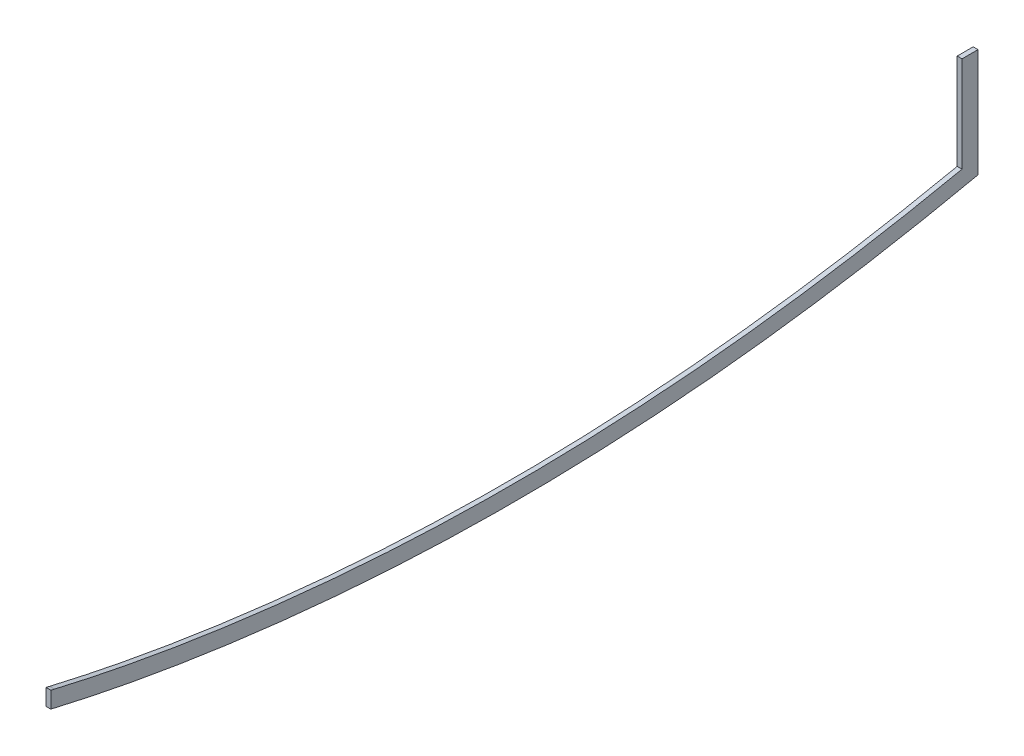
ISO-10303-21;
HEADER;
FILE_DESCRIPTION(('STEP AP214'),'2;1');
FILE_NAME('part.step','',(''),(''),'','','');
FILE_SCHEMA(('AUTOMOTIVE_DESIGN { 1 0 10303 214 1 1 1 1 }'));
ENDSEC;
DATA;
#1=APPLICATION_CONTEXT('core data for automotive mechanical design processes');
#2=APPLICATION_PROTOCOL_DEFINITION('international standard','automotive_design',2000,#1);
#3=PRODUCT_CONTEXT('',#1,'mechanical');
#4=PRODUCT('Part','Part','',(#3));
#5=PRODUCT_RELATED_PRODUCT_CATEGORY('part','',(#4));
#6=PRODUCT_DEFINITION_FORMATION('','',#4);
#7=PRODUCT_DEFINITION_CONTEXT('part definition',#1,'design');
#8=PRODUCT_DEFINITION('design','',#6,#7);
#9=PRODUCT_DEFINITION_SHAPE('','',#8);
#10=(LENGTH_UNIT() NAMED_UNIT(*) SI_UNIT(.MILLI.,.METRE.));
#11=(NAMED_UNIT(*) PLANE_ANGLE_UNIT() SI_UNIT($,.RADIAN.));
#12=(NAMED_UNIT(*) SI_UNIT($,.STERADIAN.) SOLID_ANGLE_UNIT());
#13=UNCERTAINTY_MEASURE_WITH_UNIT(LENGTH_MEASURE(1.E-05),#10,'distance_accuracy_value','');
#14=(GEOMETRIC_REPRESENTATION_CONTEXT(3) GLOBAL_UNCERTAINTY_ASSIGNED_CONTEXT((#13)) GLOBAL_UNIT_ASSIGNED_CONTEXT((#10,
#11,#12)) REPRESENTATION_CONTEXT('',''));
#15=CARTESIAN_POINT('',(0.,0.,0.));
#16=DIRECTION('',(0.,0.,1.));
#17=DIRECTION('',(1.,0.,0.));
#18=AXIS2_PLACEMENT_3D('',#15,#16,#17);
#19=CARTESIAN_POINT('',(1.51,100.,0.));
#20=DIRECTION('',(0.,0.,-1.));
#21=DIRECTION('',(0.,1.,0.));
#22=AXIS2_PLACEMENT_3D('',#19,#20,#21);
#23=PLANE('',#22);
#24=DIRECTION('',(0.,-1.,0.));
#25=VECTOR('',#24,1.);
#26=CARTESIAN_POINT('',(-1.51,100.,0.));
#27=LINE('',#26,#25);
#28=CARTESIAN_POINT('',(-1.51,100.,0.));
#29=VERTEX_POINT('',#28);
#30=CARTESIAN_POINT('',(-1.51,32.1459010137506,0.));
#31=VERTEX_POINT('',#30);
#32=EDGE_CURVE('E218',#29,#31,#27,.T.);
#33=ORIENTED_EDGE('',*,*,#32,.F.);
#34=DIRECTION('',(-1.,0.,0.));
#35=VECTOR('',#34,1.);
#36=CARTESIAN_POINT('',(1.51,100.,0.));
#37=LINE('',#36,#35);
#38=CARTESIAN_POINT('',(1.51,100.,0.));
#39=VERTEX_POINT('',#38);
#40=EDGE_CURVE('E11',#39,#29,#37,.T.);
#41=ORIENTED_EDGE('',*,*,#40,.F.);
#42=DIRECTION('',(0.,-1.,0.));
#43=VECTOR('',#42,1.);
#44=CARTESIAN_POINT('',(1.51,42.3778465393816,0.));
#45=LINE('',#44,#43);
#46=CARTESIAN_POINT('',(1.51,32.1459010137506,0.));
#47=VERTEX_POINT('',#46);
#48=EDGE_CURVE('E55',#39,#47,#45,.T.);
#49=ORIENTED_EDGE('',*,*,#48,.T.);
#50=DIRECTION('',(-1.,0.,0.));
#51=VECTOR('',#50,1.);
#52=CARTESIAN_POINT('',(1.51,32.1459010137506,0.));
#53=LINE('',#52,#51);
#54=EDGE_CURVE('E40',#47,#31,#53,.T.);
#55=ORIENTED_EDGE('',*,*,#54,.T.);
#56=EDGE_LOOP('',(#33,#41,#49,#55));
#57=FACE_BOUND('',#56,.T.);
#58=ADVANCED_FACE('F35',(#57),#23,.T.);
#59=CARTESIAN_POINT('',(1.51,100.,0.));
#60=DIRECTION('',(0.,-1.,0.));
#61=DIRECTION('',(0.,0.,-1.));
#62=AXIS2_PLACEMENT_3D('',#59,#60,#61);
#63=PLANE('',#62);
#64=DIRECTION('',(0.,0.,1.));
#65=VECTOR('',#64,1.);
#66=CARTESIAN_POINT('',(-1.51,100.,0.));
#67=LINE('',#66,#65);
#68=CARTESIAN_POINT('',(-1.51,100.,10.));
#69=VERTEX_POINT('',#68);
#70=EDGE_CURVE('E80',#29,#69,#67,.T.);
#71=ORIENTED_EDGE('',*,*,#70,.T.);
#72=DIRECTION('',(-1.,0.,0.));
#73=VECTOR('',#72,1.);
#74=CARTESIAN_POINT('',(1.51,100.,10.));
#75=LINE('',#74,#73);
#76=CARTESIAN_POINT('',(1.51,100.,10.));
#77=VERTEX_POINT('',#76);
#78=EDGE_CURVE('E46',#77,#69,#75,.T.);
#79=ORIENTED_EDGE('',*,*,#78,.F.);
#80=DIRECTION('',(0.,0.,1.));
#81=VECTOR('',#80,1.);
#82=CARTESIAN_POINT('',(1.51,100.,0.));
#83=LINE('',#82,#81);
#84=EDGE_CURVE('E107',#39,#77,#83,.T.);
#85=ORIENTED_EDGE('',*,*,#84,.F.);
#86=ORIENTED_EDGE('',*,*,#40,.T.);
#87=EDGE_LOOP('',(#71,#79,#85,#86));
#88=FACE_BOUND('',#87,.T.);
#89=ADVANCED_FACE('F150',(#88),#63,.F.);
#90=CARTESIAN_POINT('',(1.51,100.,10.));
#91=DIRECTION('',(0.,0.,-1.));
#92=DIRECTION('',(0.,1.,0.));
#93=AXIS2_PLACEMENT_3D('',#90,#91,#92);
#94=PLANE('',#93);
#95=DIRECTION('',(0.,-1.,0.));
#96=VECTOR('',#95,1.);
#97=CARTESIAN_POINT('',(-1.51,100.,10.));
#98=LINE('',#97,#96);
#99=CARTESIAN_POINT('',(-1.51,40.232191822545,10.));
#100=VERTEX_POINT('',#99);
#101=EDGE_CURVE('E114',#69,#100,#98,.T.);
#102=ORIENTED_EDGE('',*,*,#101,.T.);
#103=DIRECTION('',(-1.,0.,0.));
#104=VECTOR('',#103,1.);
#105=CARTESIAN_POINT('',(1.51,40.232191822545,10.));
#106=LINE('',#105,#104);
#107=CARTESIAN_POINT('',(1.51,40.232191822545,10.));
#108=VERTEX_POINT('',#107);
#109=EDGE_CURVE('E111',#108,#100,#106,.T.);
#110=ORIENTED_EDGE('',*,*,#109,.F.);
#111=DIRECTION('',(0.,-1.,0.));
#112=VECTOR('',#111,1.);
#113=CARTESIAN_POINT('',(1.51,100.,10.));
#114=LINE('',#113,#112);
#115=EDGE_CURVE('E101',#77,#108,#114,.T.);
#116=ORIENTED_EDGE('',*,*,#115,.F.);
#117=ORIENTED_EDGE('',*,*,#78,.T.);
#118=EDGE_LOOP('',(#102,#110,#116,#117));
#119=FACE_BOUND('',#118,.T.);
#120=ADVANCED_FACE('F112',(#119),#94,.F.);
#121=CARTESIAN_POINT('',(1.51,41.9191898754312,2.11715457977326));
#122=CARTESIAN_POINT('',(1.51,36.7950394779556,25.771456232945));
#123=CARTESIAN_POINT('',(1.51,27.6035902050565,73.3309980357778));
#124=CARTESIAN_POINT('',(1.51,17.4373162397921,145.201303122153));
#125=CARTESIAN_POINT('',(1.51,11.3529649659935,217.502733896193));
#126=CARTESIAN_POINT('',(1.51,9.32350363042354,290.057426723332));
#127=CARTESIAN_POINT('',(1.51,11.3622259507088,362.585666446086));
#128=CARTESIAN_POINT('',(1.51,17.513405403078,434.900779803499));
#129=CARTESIAN_POINT('',(1.51,27.459673586485,506.835309128288));
#130=CARTESIAN_POINT('',(1.51,36.8957426984709,554.205734679975));
#131=CARTESIAN_POINT('',(1.51,42.4202172828877,577.712135072867));
#132=B_SPLINE_CURVE_WITH_KNOTS('',3,(#121,#122,#123,#124,#125,#126,#127,#128,#129,#130,#131),
.UNSPECIFIED.,.F.,.F.,(4,1,1,1,1,1,1,1,4),(0.,0.125,0.25,0.375,0.5,0.625,0.75,0.875,1.),.UNSPECIFIED.);
#133=DIRECTION('',(-1.,0.,0.));
#134=VECTOR('',#133,1.);
#135=SURFACE_OF_LINEAR_EXTRUSION('',#132,#134);
#136=CARTESIAN_POINT('',(-1.51,41.9191898754312,2.11715457977326));
#137=CARTESIAN_POINT('',(-1.51,36.7950394779556,25.771456232945));
#138=CARTESIAN_POINT('',(-1.51,27.6035902050565,73.3309980357778));
#139=CARTESIAN_POINT('',(-1.51,17.4373162397921,145.201303122153));
#140=CARTESIAN_POINT('',(-1.51,11.3529649659935,217.502733896193));
#141=CARTESIAN_POINT('',(-1.51,9.32350363042354,290.057426723332));
#142=CARTESIAN_POINT('',(-1.51,11.3622259507088,362.585666446086));
#143=CARTESIAN_POINT('',(-1.51,17.513405403078,434.900779803499));
#144=CARTESIAN_POINT('',(-1.51,27.459673586485,506.835309128288));
#145=CARTESIAN_POINT('',(-1.51,36.8957426984709,554.205734679975));
#146=CARTESIAN_POINT('',(-1.51,42.4202172828877,577.712135072867));
#147=B_SPLINE_CURVE_WITH_KNOTS('',3,(#136,#137,#138,#139,#140,#141,#142,#143,#144,#145,#146),
.UNSPECIFIED.,.F.,.F.,(4,1,1,1,1,1,1,1,4),(0.,0.125,0.25,0.375,0.5,0.625,0.75,0.875,1.),.UNSPECIFIED.);
#148=CARTESIAN_POINT('',(-1.51,42.4202172828877,577.712135072867));
#149=VERTEX_POINT('',#148);
#150=EDGE_CURVE('E235',#100,#149,#147,.T.);
#151=ORIENTED_EDGE('',*,*,#150,.T.);
#152=DIRECTION('',(-1.,0.,0.));
#153=VECTOR('',#152,1.);
#154=CARTESIAN_POINT('',(1.51,42.4202172828877,577.712135072867));
#155=LINE('',#154,#153);
#156=CARTESIAN_POINT('',(1.51,42.4202172828877,577.712135072867));
#157=VERTEX_POINT('',#156);
#158=EDGE_CURVE('E117',#157,#149,#155,.T.);
#159=ORIENTED_EDGE('',*,*,#158,.F.);
#160=EDGE_CURVE('E105',#108,#157,#132,.T.);
#161=ORIENTED_EDGE('',*,*,#160,.F.);
#162=ORIENTED_EDGE('',*,*,#109,.T.);
#163=EDGE_LOOP('',(#151,#159,#161,#162));
#164=FACE_BOUND('',#163,.T.);
#165=ADVANCED_FACE('F119',(#164),#135,.F.);
#166=CARTESIAN_POINT('',(1.51,42.4202172828877,577.712135072867));
#167=DIRECTION('',(0.,-0.973476635271955,0.228786451914427));
#168=DIRECTION('',(0.,-0.228786451914427,-0.973476635271955));
#169=AXIS2_PLACEMENT_3D('',#166,#167,#168);
#170=PLANE('',#169);
#171=DIRECTION('',(0.,0.228786451914427,0.973476635271955));
#172=VECTOR('',#171,1.);
#173=CARTESIAN_POINT('',(-1.51,42.4202172828877,577.712135072867));
#174=LINE('',#173,#172);
#175=CARTESIAN_POINT('',(-1.51,42.9579111389372,579.999999592));
#176=VERTEX_POINT('',#175);
#177=EDGE_CURVE('E226',#149,#176,#174,.T.);
#178=ORIENTED_EDGE('',*,*,#177,.T.);
#179=DIRECTION('',(-1.,0.,0.));
#180=VECTOR('',#179,1.);
#181=CARTESIAN_POINT('',(1.51,42.9579111389372,579.999999592));
#182=LINE('',#181,#180);
#183=CARTESIAN_POINT('',(1.51,42.9579111389372,579.999999592));
#184=VERTEX_POINT('',#183);
#185=EDGE_CURVE('E246',#184,#176,#182,.T.);
#186=ORIENTED_EDGE('',*,*,#185,.F.);
#187=DIRECTION('',(0.,0.228786451914427,0.973476635271955));
#188=VECTOR('',#187,1.);
#189=CARTESIAN_POINT('',(1.51,42.4202172828877,577.712135072867));
#190=LINE('',#189,#188);
#191=EDGE_CURVE('E122',#157,#184,#190,.T.);
#192=ORIENTED_EDGE('',*,*,#191,.F.);
#193=ORIENTED_EDGE('',*,*,#158,.T.);
#194=EDGE_LOOP('',(#178,#186,#192,#193));
#195=FACE_BOUND('',#194,.T.);
#196=ADVANCED_FACE('F138',(#195),#170,.F.);
#197=CARTESIAN_POINT('',(1.51,42.9579111389372,579.999999592));
#198=DIRECTION('',(0.,0.,-1.));
#199=DIRECTION('',(-1.,0.,0.));
#200=AXIS2_PLACEMENT_3D('',#197,#198,#199);
#201=PLANE('',#200);
#202=DIRECTION('',(0.,-1.,0.));
#203=VECTOR('',#202,1.);
#204=CARTESIAN_POINT('',(-1.51,42.9579111389372,579.999999592));
#205=LINE('',#204,#203);
#206=CARTESIAN_POINT('',(-1.51,32.6854509301656,579.999999592));
#207=VERTEX_POINT('',#206);
#208=EDGE_CURVE('E224',#176,#207,#205,.T.);
#209=ORIENTED_EDGE('',*,*,#208,.T.);
#210=DIRECTION('',(-1.,0.,0.));
#211=VECTOR('',#210,1.);
#212=CARTESIAN_POINT('',(1.51,32.6854509301656,579.999999592));
#213=LINE('',#212,#211);
#214=CARTESIAN_POINT('',(1.51,32.6854509301656,579.999999592));
#215=VERTEX_POINT('',#214);
#216=EDGE_CURVE('E222',#215,#207,#213,.T.);
#217=ORIENTED_EDGE('',*,*,#216,.F.);
#218=DIRECTION('',(0.,-1.,0.));
#219=VECTOR('',#218,1.);
#220=CARTESIAN_POINT('',(1.51,42.9579111389372,579.999999592));
#221=LINE('',#220,#219);
#222=EDGE_CURVE('E124',#184,#215,#221,.T.);
#223=ORIENTED_EDGE('',*,*,#222,.F.);
#224=ORIENTED_EDGE('',*,*,#185,.T.);
#225=EDGE_LOOP('',(#209,#217,#223,#224));
#226=FACE_BOUND('',#225,.T.);
#227=ADVANCED_FACE('F141',(#226),#201,.F.);
#228=CARTESIAN_POINT('',(1.51,32.1459010137506,0.));
#229=CARTESIAN_POINT('',(1.51,21.4173960147435,49.5253307808122));
#230=CARTESIAN_POINT('',(1.51,7.42968345746041,132.611366977737));
#231=CARTESIAN_POINT('',(1.51,-0.655976348051946,249.881952901825));
#232=CARTESIAN_POINT('',(1.51,0.0943384071876584,350.181116019129));
#233=CARTESIAN_POINT('',(1.51,9.54780018048424,460.66830784896));
#234=CARTESIAN_POINT('',(1.51,22.6163912825528,537.156578470954));
#235=CARTESIAN_POINT('',(1.51,32.6854509301656,579.999999592));
#236=B_SPLINE_CURVE_WITH_KNOTS('',3,(#228,#229,#230,#231,#232,#233,#234,#235),.UNSPECIFIED.,.F.,
.F.,(4,1,1,1,1,4),(0.,0.260060421213628,0.431503634313393,0.60254305230773,0.774188809599633,
1.),.UNSPECIFIED.);
#237=DIRECTION('',(-1.,0.,0.));
#238=VECTOR('',#237,1.);
#239=SURFACE_OF_LINEAR_EXTRUSION('',#236,#238);
#240=CARTESIAN_POINT('',(-1.51,32.1459010137506,0.));
#241=CARTESIAN_POINT('',(-1.51,21.4173960147435,49.5253307808122));
#242=CARTESIAN_POINT('',(-1.51,7.42968345746041,132.611366977737));
#243=CARTESIAN_POINT('',(-1.51,-0.655976348051946,249.881952901825));
#244=CARTESIAN_POINT('',(-1.51,0.0943384071876584,350.181116019129));
#245=CARTESIAN_POINT('',(-1.51,9.54780018048424,460.66830784896));
#246=CARTESIAN_POINT('',(-1.51,22.6163912825528,537.156578470954));
#247=CARTESIAN_POINT('',(-1.51,32.6854509301656,579.999999592));
#248=B_SPLINE_CURVE_WITH_KNOTS('',3,(#240,#241,#242,#243,#244,#245,#246,#247),.UNSPECIFIED.,.F.,
.F.,(4,1,1,1,1,4),(0.,0.260060421213628,0.431503634313393,0.60254305230773,0.774188809599633,
1.),.UNSPECIFIED.);
#249=EDGE_CURVE('E220',#31,#207,#248,.T.);
#250=ORIENTED_EDGE('',*,*,#249,.F.);
#251=ORIENTED_EDGE('',*,*,#54,.F.);
#252=EDGE_CURVE('E251',#47,#215,#236,.T.);
#253=ORIENTED_EDGE('',*,*,#252,.T.);
#254=ORIENTED_EDGE('',*,*,#216,.T.);
#255=EDGE_LOOP('',(#250,#251,#253,#254));
#256=FACE_BOUND('',#255,.T.);
#257=ADVANCED_FACE('F37',(#256),#239,.T.);
#258=CARTESIAN_POINT('',(1.51,0.00154628357914932,290.05316615269));
#259=DIRECTION('',(1.,0.,0.));
#260=DIRECTION('',(0.,0.,-1.));
#261=AXIS2_PLACEMENT_3D('',#258,#259,#260);
#262=PLANE('',#261);
#263=ORIENTED_EDGE('',*,*,#48,.F.);
#264=ORIENTED_EDGE('',*,*,#84,.T.);
#265=ORIENTED_EDGE('',*,*,#115,.T.);
#266=ORIENTED_EDGE('',*,*,#160,.T.);
#267=ORIENTED_EDGE('',*,*,#191,.T.);
#268=ORIENTED_EDGE('',*,*,#222,.T.);
#269=ORIENTED_EDGE('',*,*,#252,.F.);
#270=EDGE_LOOP('',(#263,#264,#265,#266,#267,#268,#269));
#271=FACE_BOUND('',#270,.T.);
#272=ADVANCED_FACE('F103',(#271),#262,.T.);
#273=CARTESIAN_POINT('',(-1.51,0.00154628357914932,290.05316615269));
#274=DIRECTION('',(1.,0.,0.));
#275=DIRECTION('',(0.,0.,-1.));
#276=AXIS2_PLACEMENT_3D('',#273,#274,#275);
#277=PLANE('',#276);
#278=ORIENTED_EDGE('',*,*,#32,.T.);
#279=ORIENTED_EDGE('',*,*,#249,.T.);
#280=ORIENTED_EDGE('',*,*,#208,.F.);
#281=ORIENTED_EDGE('',*,*,#177,.F.);
#282=ORIENTED_EDGE('',*,*,#150,.F.);
#283=ORIENTED_EDGE('',*,*,#101,.F.);
#284=ORIENTED_EDGE('',*,*,#70,.F.);
#285=EDGE_LOOP('',(#278,#279,#280,#281,#282,#283,#284));
#286=FACE_BOUND('',#285,.T.);
#287=ADVANCED_FACE('F158',(#286),#277,.F.);
#288=CLOSED_SHELL('',(#58,#89,#120,#165,#196,#227,#257,#272,#287));
#289=MANIFOLD_SOLID_BREP('B2',#288);
#290=ADVANCED_BREP_SHAPE_REPRESENTATION('',(#18,#289),#14);
#291=SHAPE_DEFINITION_REPRESENTATION(#9,#290);
ENDSEC;
END-ISO-10303-21;
